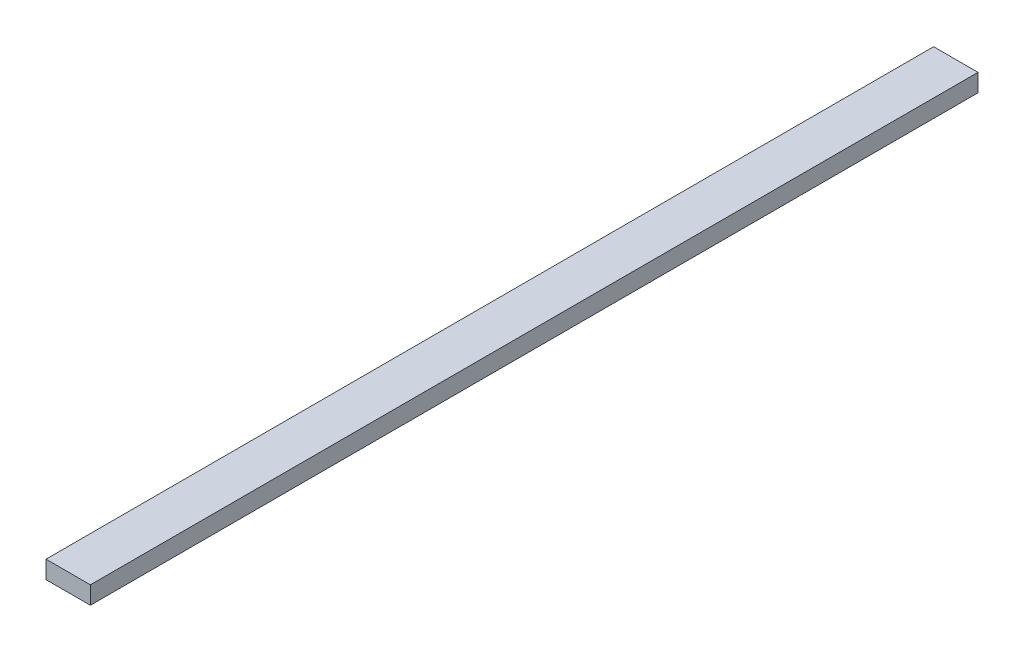
ISO-10303-21;
HEADER;
FILE_DESCRIPTION(('STEP AP214'),'2;1');
FILE_NAME('part.step','',(''),(''),'','','');
FILE_SCHEMA(('AUTOMOTIVE_DESIGN { 1 0 10303 214 1 1 1 1 }'));
ENDSEC;
DATA;
#1=APPLICATION_CONTEXT('core data for automotive mechanical design processes');
#2=APPLICATION_PROTOCOL_DEFINITION('international standard','automotive_design',2000,#1);
#3=PRODUCT_CONTEXT('',#1,'mechanical');
#4=PRODUCT('Part','Part','',(#3));
#5=PRODUCT_RELATED_PRODUCT_CATEGORY('part','',(#4));
#6=PRODUCT_DEFINITION_FORMATION('','',#4);
#7=PRODUCT_DEFINITION_CONTEXT('part definition',#1,'design');
#8=PRODUCT_DEFINITION('design','',#6,#7);
#9=PRODUCT_DEFINITION_SHAPE('','',#8);
#10=(LENGTH_UNIT() NAMED_UNIT(*) SI_UNIT(.MILLI.,.METRE.));
#11=(NAMED_UNIT(*) PLANE_ANGLE_UNIT() SI_UNIT($,.RADIAN.));
#12=(NAMED_UNIT(*) SI_UNIT($,.STERADIAN.) SOLID_ANGLE_UNIT());
#13=UNCERTAINTY_MEASURE_WITH_UNIT(LENGTH_MEASURE(1.E-05),#10,'distance_accuracy_value','');
#14=(GEOMETRIC_REPRESENTATION_CONTEXT(3) GLOBAL_UNCERTAINTY_ASSIGNED_CONTEXT((#13)) GLOBAL_UNIT_ASSIGNED_CONTEXT((#10,
#11,#12)) REPRESENTATION_CONTEXT('',''));
#15=CARTESIAN_POINT('',(0.,0.,0.));
#16=DIRECTION('',(0.,0.,1.));
#17=DIRECTION('',(1.,0.,0.));
#18=AXIS2_PLACEMENT_3D('',#15,#16,#17);
#19=CARTESIAN_POINT('',(1.25,-2.49999999999998,-125.));
#20=DIRECTION('',(0.,1.,0.));
#21=DIRECTION('',(0.,0.,1.));
#22=AXIS2_PLACEMENT_3D('',#19,#20,#21);
#23=PLANE('',#22);
#24=DIRECTION('',(-1.,0.,0.));
#25=VECTOR('',#24,1.);
#26=CARTESIAN_POINT('',(1.25,-2.49999999999998,-125.));
#27=LINE('',#26,#25);
#28=CARTESIAN_POINT('',(8.75,-2.49999999999998,-125.));
#29=VERTEX_POINT('',#28);
#30=CARTESIAN_POINT('',(-3.75,-2.49999999999998,-125.));
#31=VERTEX_POINT('',#30);
#32=EDGE_CURVE('E119',#29,#31,#27,.T.);
#33=ORIENTED_EDGE('',*,*,#32,.F.);
#34=DIRECTION('',(0.,0.,-1.));
#35=VECTOR('',#34,1.);
#36=CARTESIAN_POINT('',(8.75,-2.50000000000002,125.));
#37=LINE('',#36,#35);
#38=CARTESIAN_POINT('',(8.75,-2.50000000000002,125.));
#39=VERTEX_POINT('',#38);
#40=EDGE_CURVE('E12',#39,#29,#37,.T.);
#41=ORIENTED_EDGE('',*,*,#40,.F.);
#42=DIRECTION('',(1.,0.,0.));
#43=VECTOR('',#42,1.);
#44=CARTESIAN_POINT('',(-3.75,-2.49999999999998,125.));
#45=LINE('',#44,#43);
#46=CARTESIAN_POINT('',(-3.75,-2.49999999999998,125.));
#47=VERTEX_POINT('',#46);
#48=EDGE_CURVE('E129',#47,#39,#45,.T.);
#49=ORIENTED_EDGE('',*,*,#48,.F.);
#50=DIRECTION('',(0.,0.,-1.));
#51=VECTOR('',#50,1.);
#52=CARTESIAN_POINT('',(-3.75,-2.49999999999998,75.0000000000001));
#53=LINE('',#52,#51);
#54=EDGE_CURVE('E120',#47,#31,#53,.T.);
#55=ORIENTED_EDGE('',*,*,#54,.T.);
#56=EDGE_LOOP('',(#33,#41,#49,#55));
#57=FACE_BOUND('',#56,.T.);
#58=ADVANCED_FACE('F71',(#57),#23,.F.);
#59=CARTESIAN_POINT('',(1.25,2.50000000000002,-125.));
#60=DIRECTION('',(0.,-1.,0.));
#61=DIRECTION('',(0.,0.,-1.));
#62=AXIS2_PLACEMENT_3D('',#59,#60,#61);
#63=PLANE('',#62);
#64=DIRECTION('',(-1.,0.,0.));
#65=VECTOR('',#64,1.);
#66=CARTESIAN_POINT('',(1.25,2.50000000000002,-125.));
#67=LINE('',#66,#65);
#68=CARTESIAN_POINT('',(8.75,2.50000000000002,-125.));
#69=VERTEX_POINT('',#68);
#70=CARTESIAN_POINT('',(-3.75,2.50000000000002,-125.));
#71=VERTEX_POINT('',#70);
#72=EDGE_CURVE('E110',#69,#71,#67,.T.);
#73=ORIENTED_EDGE('',*,*,#72,.T.);
#74=DIRECTION('',(0.,0.,-1.));
#75=VECTOR('',#74,1.);
#76=CARTESIAN_POINT('',(-3.75,2.5,75.0000000000001));
#77=LINE('',#76,#75);
#78=CARTESIAN_POINT('',(-3.75,2.49999999999999,125.));
#79=VERTEX_POINT('',#78);
#80=EDGE_CURVE('E75',#79,#71,#77,.T.);
#81=ORIENTED_EDGE('',*,*,#80,.F.);
#82=DIRECTION('',(-1.,0.,0.));
#83=VECTOR('',#82,1.);
#84=CARTESIAN_POINT('',(1.25,2.49999999999999,125.));
#85=LINE('',#84,#83);
#86=CARTESIAN_POINT('',(8.75,2.49999999999999,125.));
#87=VERTEX_POINT('',#86);
#88=EDGE_CURVE('E89',#87,#79,#85,.T.);
#89=ORIENTED_EDGE('',*,*,#88,.F.);
#90=DIRECTION('',(0.,0.,1.));
#91=VECTOR('',#90,1.);
#92=CARTESIAN_POINT('',(8.75,2.50000000000002,-125.));
#93=LINE('',#92,#91);
#94=EDGE_CURVE('E123',#69,#87,#93,.T.);
#95=ORIENTED_EDGE('',*,*,#94,.F.);
#96=EDGE_LOOP('',(#73,#81,#89,#95));
#97=FACE_BOUND('',#96,.T.);
#98=ADVANCED_FACE('F124',(#97),#63,.F.);
#99=CARTESIAN_POINT('',(1.25,-2.49999999999998,-125.));
#100=DIRECTION('',(0.,0.,1.));
#101=DIRECTION('',(1.,0.,0.));
#102=AXIS2_PLACEMENT_3D('',#99,#100,#101);
#103=PLANE('',#102);
#104=DIRECTION('',(0.,-1.,0.));
#105=VECTOR('',#104,1.);
#106=CARTESIAN_POINT('',(-3.75,0.,-125.));
#107=LINE('',#106,#105);
#108=EDGE_CURVE('E116',#71,#31,#107,.T.);
#109=ORIENTED_EDGE('',*,*,#108,.F.);
#110=ORIENTED_EDGE('',*,*,#72,.F.);
#111=DIRECTION('',(0.,1.,0.));
#112=VECTOR('',#111,1.);
#113=CARTESIAN_POINT('',(8.75,-2.49999999999998,-125.));
#114=LINE('',#113,#112);
#115=EDGE_CURVE('E115',#29,#69,#114,.T.);
#116=ORIENTED_EDGE('',*,*,#115,.F.);
#117=ORIENTED_EDGE('',*,*,#32,.T.);
#118=EDGE_LOOP('',(#109,#110,#116,#117));
#119=FACE_BOUND('',#118,.T.);
#120=ADVANCED_FACE('F112',(#119),#103,.F.);
#121=CARTESIAN_POINT('',(-3.75,0.,75.0000000000001));
#122=DIRECTION('',(1.,0.,0.));
#123=DIRECTION('',(0.,1.,0.));
#124=AXIS2_PLACEMENT_3D('',#121,#122,#123);
#125=PLANE('',#124);
#126=DIRECTION('',(0.,-1.,0.));
#127=VECTOR('',#126,1.);
#128=CARTESIAN_POINT('',(-3.74999999999999,37.8,125.));
#129=LINE('',#128,#127);
#130=EDGE_CURVE('E133',#79,#47,#129,.T.);
#131=ORIENTED_EDGE('',*,*,#130,.F.);
#132=ORIENTED_EDGE('',*,*,#80,.T.);
#133=ORIENTED_EDGE('',*,*,#108,.T.);
#134=ORIENTED_EDGE('',*,*,#54,.F.);
#135=EDGE_LOOP('',(#131,#132,#133,#134));
#136=FACE_BOUND('',#135,.T.);
#137=ADVANCED_FACE('F141',(#136),#125,.F.);
#138=CARTESIAN_POINT('',(0.,0.,125.));
#139=DIRECTION('',(0.,0.,1.));
#140=DIRECTION('',(1.,0.,0.));
#141=AXIS2_PLACEMENT_3D('',#138,#139,#140);
#142=PLANE('',#141);
#143=ORIENTED_EDGE('',*,*,#88,.T.);
#144=ORIENTED_EDGE('',*,*,#130,.T.);
#145=ORIENTED_EDGE('',*,*,#48,.T.);
#146=DIRECTION('',(0.,-1.,0.));
#147=VECTOR('',#146,1.);
#148=CARTESIAN_POINT('',(8.75,2.49999999999999,125.));
#149=LINE('',#148,#147);
#150=EDGE_CURVE('E81',#87,#39,#149,.T.);
#151=ORIENTED_EDGE('',*,*,#150,.F.);
#152=EDGE_LOOP('',(#143,#144,#145,#151));
#153=FACE_BOUND('',#152,.T.);
#154=ADVANCED_FACE('F144',(#153),#142,.T.);
#155=CARTESIAN_POINT('',(8.75,0.,0.));
#156=DIRECTION('',(1.,0.,0.));
#157=DIRECTION('',(0.,0.,-1.));
#158=AXIS2_PLACEMENT_3D('',#155,#156,#157);
#159=PLANE('',#158);
#160=ORIENTED_EDGE('',*,*,#115,.T.);
#161=ORIENTED_EDGE('',*,*,#94,.T.);
#162=ORIENTED_EDGE('',*,*,#150,.T.);
#163=ORIENTED_EDGE('',*,*,#40,.T.);
#164=EDGE_LOOP('',(#160,#161,#162,#163));
#165=FACE_BOUND('',#164,.T.);
#166=ADVANCED_FACE('F73',(#165),#159,.T.);
#167=CLOSED_SHELL('',(#58,#98,#120,#137,#154,#166));
#168=MANIFOLD_SOLID_BREP('B2',#167);
#169=ADVANCED_BREP_SHAPE_REPRESENTATION('',(#18,#168),#14);
#170=SHAPE_DEFINITION_REPRESENTATION(#9,#169);
ENDSEC;
END-ISO-10303-21;
